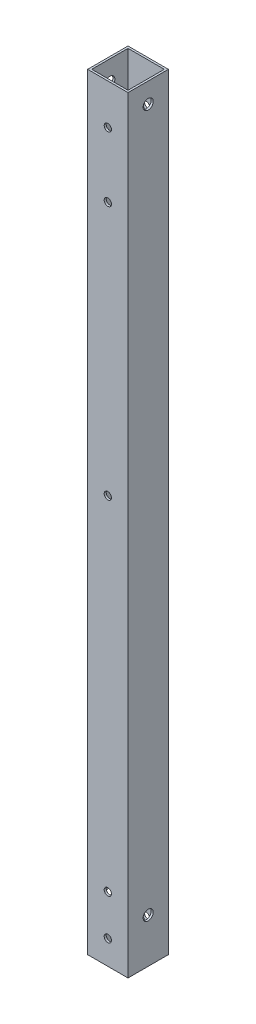
ISO-10303-21;
HEADER;
FILE_DESCRIPTION(('STEP AP214'),'2;1');
FILE_NAME('part.step','',(''),(''),'','','');
FILE_SCHEMA(('AUTOMOTIVE_DESIGN { 1 0 10303 214 1 1 1 1 }'));
ENDSEC;
DATA;
#1=APPLICATION_CONTEXT('core data for automotive mechanical design processes');
#2=APPLICATION_PROTOCOL_DEFINITION('international standard','automotive_design',2000,#1);
#3=PRODUCT_CONTEXT('',#1,'mechanical');
#4=PRODUCT('Part','Part','',(#3));
#5=PRODUCT_RELATED_PRODUCT_CATEGORY('part','',(#4));
#6=PRODUCT_DEFINITION_FORMATION('','',#4);
#7=PRODUCT_DEFINITION_CONTEXT('part definition',#1,'design');
#8=PRODUCT_DEFINITION('design','',#6,#7);
#9=PRODUCT_DEFINITION_SHAPE('','',#8);
#10=(LENGTH_UNIT() NAMED_UNIT(*) SI_UNIT(.MILLI.,.METRE.));
#11=(NAMED_UNIT(*) PLANE_ANGLE_UNIT() SI_UNIT($,.RADIAN.));
#12=(NAMED_UNIT(*) SI_UNIT($,.STERADIAN.) SOLID_ANGLE_UNIT());
#13=UNCERTAINTY_MEASURE_WITH_UNIT(LENGTH_MEASURE(1.E-05),#10,'distance_accuracy_value','');
#14=(GEOMETRIC_REPRESENTATION_CONTEXT(3) GLOBAL_UNCERTAINTY_ASSIGNED_CONTEXT((#13)) GLOBAL_UNIT_ASSIGNED_CONTEXT((#10,
#11,#12)) REPRESENTATION_CONTEXT('',''));
#15=CARTESIAN_POINT('',(0.,0.,0.));
#16=DIRECTION('',(0.,0.,1.));
#17=DIRECTION('',(1.,0.,0.));
#18=AXIS2_PLACEMENT_3D('',#15,#16,#17);
#19=CARTESIAN_POINT('',(0.,482.6,0.));
#20=DIRECTION('',(0.,-1.,0.));
#21=DIRECTION('',(0.,0.,-1.));
#22=AXIS2_PLACEMENT_3D('',#19,#20,#21);
#23=PLANE('',#22);
#24=DIRECTION('',(1.,0.,0.));
#25=VECTOR('',#24,1.);
#26=CARTESIAN_POINT('',(25.4,482.6,0.));
#27=LINE('',#26,#25);
#28=CARTESIAN_POINT('',(0.,482.6,0.));
#29=VERTEX_POINT('',#28);
#30=CARTESIAN_POINT('',(25.4,482.6,0.));
#31=VERTEX_POINT('',#30);
#32=EDGE_CURVE('E155',#29,#31,#27,.T.);
#33=ORIENTED_EDGE('',*,*,#32,.T.);
#34=DIRECTION('',(0.,0.,-1.));
#35=VECTOR('',#34,1.);
#36=CARTESIAN_POINT('',(25.4,482.6,-25.4));
#37=LINE('',#36,#35);
#38=CARTESIAN_POINT('',(25.4,482.6,-25.4));
#39=VERTEX_POINT('',#38);
#40=EDGE_CURVE('E159',#31,#39,#37,.T.);
#41=ORIENTED_EDGE('',*,*,#40,.T.);
#42=DIRECTION('',(-1.,0.,0.));
#43=VECTOR('',#42,1.);
#44=CARTESIAN_POINT('',(0.,482.6,-25.4));
#45=LINE('',#44,#43);
#46=CARTESIAN_POINT('',(0.,482.6,-25.4));
#47=VERTEX_POINT('',#46);
#48=EDGE_CURVE('E163',#39,#47,#45,.T.);
#49=ORIENTED_EDGE('',*,*,#48,.T.);
#50=DIRECTION('',(0.,0.,1.));
#51=VECTOR('',#50,1.);
#52=CARTESIAN_POINT('',(0.,482.6,0.));
#53=LINE('',#52,#51);
#54=EDGE_CURVE('E166',#47,#29,#53,.T.);
#55=ORIENTED_EDGE('',*,*,#54,.T.);
#56=EDGE_LOOP('',(#33,#41,#49,#55));
#57=FACE_BOUND('',#56,.T.);
#58=DIRECTION('',(1.,0.,0.));
#59=VECTOR('',#58,1.);
#60=CARTESIAN_POINT('',(1.27,482.6,-1.27));
#61=LINE('',#60,#59);
#62=CARTESIAN_POINT('',(1.27,482.6,-1.27));
#63=VERTEX_POINT('',#62);
#64=CARTESIAN_POINT('',(24.13,482.6,-1.27));
#65=VERTEX_POINT('',#64);
#66=EDGE_CURVE('E109',#63,#65,#61,.T.);
#67=ORIENTED_EDGE('',*,*,#66,.F.);
#68=DIRECTION('',(0.,0.,1.));
#69=VECTOR('',#68,1.);
#70=CARTESIAN_POINT('',(1.27,482.6,-12.3614591557052));
#71=LINE('',#70,#69);
#72=CARTESIAN_POINT('',(1.27,482.6,-24.13));
#73=VERTEX_POINT('',#72);
#74=EDGE_CURVE('E103',#73,#63,#71,.T.);
#75=ORIENTED_EDGE('',*,*,#74,.F.);
#76=DIRECTION('',(-1.,0.,0.));
#77=VECTOR('',#76,1.);
#78=CARTESIAN_POINT('',(12.7,482.6,-24.13));
#79=LINE('',#78,#77);
#80=CARTESIAN_POINT('',(24.13,482.6,-24.13));
#81=VERTEX_POINT('',#80);
#82=EDGE_CURVE('E128',#81,#73,#79,.T.);
#83=ORIENTED_EDGE('',*,*,#82,.F.);
#84=DIRECTION('',(0.,0.,-1.));
#85=VECTOR('',#84,1.);
#86=CARTESIAN_POINT('',(24.13,482.6,-1.27));
#87=LINE('',#86,#85);
#88=EDGE_CURVE('E124',#65,#81,#87,.T.);
#89=ORIENTED_EDGE('',*,*,#88,.F.);
#90=EDGE_LOOP('',(#67,#75,#83,#89));
#91=FACE_BOUND('',#90,.T.);
#92=ADVANCED_FACE('F38',(#57,#91),#23,.F.);
#93=CARTESIAN_POINT('',(0.,0.,0.));
#94=DIRECTION('',(0.,-1.,0.));
#95=DIRECTION('',(0.,0.,-1.));
#96=AXIS2_PLACEMENT_3D('',#93,#94,#95);
#97=PLANE('',#96);
#98=DIRECTION('',(1.,0.,0.));
#99=VECTOR('',#98,1.);
#100=CARTESIAN_POINT('',(25.4,0.,0.));
#101=LINE('',#100,#99);
#102=CARTESIAN_POINT('',(0.,0.,0.));
#103=VERTEX_POINT('',#102);
#104=CARTESIAN_POINT('',(25.4,0.,0.));
#105=VERTEX_POINT('',#104);
#106=EDGE_CURVE('E120',#103,#105,#101,.T.);
#107=ORIENTED_EDGE('',*,*,#106,.F.);
#108=DIRECTION('',(0.,0.,1.));
#109=VECTOR('',#108,1.);
#110=CARTESIAN_POINT('',(0.,0.,0.));
#111=LINE('',#110,#109);
#112=CARTESIAN_POINT('',(0.,0.,-25.4));
#113=VERTEX_POINT('',#112);
#114=EDGE_CURVE('E160',#113,#103,#111,.T.);
#115=ORIENTED_EDGE('',*,*,#114,.F.);
#116=DIRECTION('',(-1.,0.,0.));
#117=VECTOR('',#116,1.);
#118=CARTESIAN_POINT('',(0.,0.,-25.4));
#119=LINE('',#118,#117);
#120=CARTESIAN_POINT('',(25.4,0.,-25.4));
#121=VERTEX_POINT('',#120);
#122=EDGE_CURVE('E176',#121,#113,#119,.T.);
#123=ORIENTED_EDGE('',*,*,#122,.F.);
#124=DIRECTION('',(0.,0.,-1.));
#125=VECTOR('',#124,1.);
#126=CARTESIAN_POINT('',(25.4,0.,-25.4));
#127=LINE('',#126,#125);
#128=EDGE_CURVE('E173',#105,#121,#127,.T.);
#129=ORIENTED_EDGE('',*,*,#128,.F.);
#130=EDGE_LOOP('',(#107,#115,#123,#129));
#131=FACE_BOUND('',#130,.T.);
#132=DIRECTION('',(0.,0.,1.));
#133=VECTOR('',#132,1.);
#134=CARTESIAN_POINT('',(1.27,0.,-12.3614591557052));
#135=LINE('',#134,#133);
#136=CARTESIAN_POINT('',(1.27,0.,-24.13));
#137=VERTEX_POINT('',#136);
#138=CARTESIAN_POINT('',(1.27,0.,-1.27));
#139=VERTEX_POINT('',#138);
#140=EDGE_CURVE('E110',#137,#139,#135,.T.);
#141=ORIENTED_EDGE('',*,*,#140,.T.);
#142=DIRECTION('',(1.,0.,0.));
#143=VECTOR('',#142,1.);
#144=CARTESIAN_POINT('',(24.13,0.,-1.27));
#145=LINE('',#144,#143);
#146=CARTESIAN_POINT('',(24.13,0.,-1.27));
#147=VERTEX_POINT('',#146);
#148=EDGE_CURVE('E117',#139,#147,#145,.T.);
#149=ORIENTED_EDGE('',*,*,#148,.T.);
#150=DIRECTION('',(0.,0.,-1.));
#151=VECTOR('',#150,1.);
#152=CARTESIAN_POINT('',(24.13,0.,-24.13));
#153=LINE('',#152,#151);
#154=CARTESIAN_POINT('',(24.13,0.,-24.13));
#155=VERTEX_POINT('',#154);
#156=EDGE_CURVE('E136',#147,#155,#153,.T.);
#157=ORIENTED_EDGE('',*,*,#156,.T.);
#158=DIRECTION('',(-1.,0.,0.));
#159=VECTOR('',#158,1.);
#160=CARTESIAN_POINT('',(1.27,0.,-24.13));
#161=LINE('',#160,#159);
#162=EDGE_CURVE('E141',#155,#137,#161,.T.);
#163=ORIENTED_EDGE('',*,*,#162,.T.);
#164=EDGE_LOOP('',(#141,#149,#157,#163));
#165=FACE_BOUND('',#164,.T.);
#166=ADVANCED_FACE('F314',(#131,#165),#97,.T.);
#167=CARTESIAN_POINT('',(25.4,482.6,0.));
#168=DIRECTION('',(0.,0.,-1.));
#169=DIRECTION('',(-1.,0.,0.));
#170=AXIS2_PLACEMENT_3D('',#167,#168,#169);
#171=PLANE('',#170);
#172=CARTESIAN_POINT('',(12.7,15.24,0.));
#173=DIRECTION('',(0.,0.,-1.));
#174=DIRECTION('',(-1.,0.,0.));
#175=AXIS2_PLACEMENT_3D('',#172,#173,#174);
#176=CIRCLE('',#175,2.286);
#177=CARTESIAN_POINT('',(10.414,15.24,0.));
#178=VERTEX_POINT('',#177);
#179=EDGE_CURVE('E218',#178,#178,#176,.T.);
#180=ORIENTED_EDGE('',*,*,#179,.T.);
#181=EDGE_LOOP('',(#180));
#182=FACE_BOUND('',#181,.T.);
#183=CARTESIAN_POINT('',(12.7,457.2,0.));
#184=DIRECTION('',(0.,0.,-1.));
#185=DIRECTION('',(-1.,0.,0.));
#186=AXIS2_PLACEMENT_3D('',#183,#184,#185);
#187=CIRCLE('',#186,2.28600000000001);
#188=CARTESIAN_POINT('',(10.414,457.2,0.));
#189=VERTEX_POINT('',#188);
#190=EDGE_CURVE('E213',#189,#189,#187,.T.);
#191=ORIENTED_EDGE('',*,*,#190,.T.);
#192=EDGE_LOOP('',(#191));
#193=FACE_BOUND('',#192,.T.);
#194=CARTESIAN_POINT('',(12.7,256.54,0.));
#195=DIRECTION('',(0.,0.,-1.));
#196=DIRECTION('',(-1.,0.,0.));
#197=AXIS2_PLACEMENT_3D('',#194,#195,#196);
#198=CIRCLE('',#197,2.28600000000001);
#199=CARTESIAN_POINT('',(10.414,256.54,0.));
#200=VERTEX_POINT('',#199);
#201=EDGE_CURVE('E207',#200,#200,#198,.T.);
#202=ORIENTED_EDGE('',*,*,#201,.T.);
#203=EDGE_LOOP('',(#202));
#204=FACE_BOUND('',#203,.T.);
#205=CARTESIAN_POINT('',(12.7,40.64,0.));
#206=DIRECTION('',(0.,0.,-1.));
#207=DIRECTION('',(-1.,0.,0.));
#208=AXIS2_PLACEMENT_3D('',#205,#206,#207);
#209=CIRCLE('',#208,2.286);
#210=CARTESIAN_POINT('',(10.414,40.64,0.));
#211=VERTEX_POINT('',#210);
#212=EDGE_CURVE('E201',#211,#211,#209,.T.);
#213=ORIENTED_EDGE('',*,*,#212,.T.);
#214=EDGE_LOOP('',(#213));
#215=FACE_BOUND('',#214,.T.);
#216=CARTESIAN_POINT('',(12.7,416.56,0.));
#217=DIRECTION('',(0.,0.,-1.));
#218=DIRECTION('',(-1.,0.,0.));
#219=AXIS2_PLACEMENT_3D('',#216,#217,#218);
#220=CIRCLE('',#219,2.28600000000001);
#221=CARTESIAN_POINT('',(10.414,416.56,0.));
#222=VERTEX_POINT('',#221);
#223=EDGE_CURVE('E195',#222,#222,#220,.T.);
#224=ORIENTED_EDGE('',*,*,#223,.T.);
#225=EDGE_LOOP('',(#224));
#226=FACE_BOUND('',#225,.T.);
#227=ORIENTED_EDGE('',*,*,#106,.T.);
#228=DIRECTION('',(0.,-1.,0.));
#229=VECTOR('',#228,1.);
#230=CARTESIAN_POINT('',(25.4,482.6,0.));
#231=LINE('',#230,#229);
#232=EDGE_CURVE('E11',#31,#105,#231,.T.);
#233=ORIENTED_EDGE('',*,*,#232,.F.);
#234=ORIENTED_EDGE('',*,*,#32,.F.);
#235=DIRECTION('',(0.,-1.,0.));
#236=VECTOR('',#235,1.);
#237=CARTESIAN_POINT('',(0.,482.6,0.));
#238=LINE('',#237,#236);
#239=EDGE_CURVE('E169',#29,#103,#238,.T.);
#240=ORIENTED_EDGE('',*,*,#239,.T.);
#241=EDGE_LOOP('',(#227,#233,#234,#240));
#242=FACE_BOUND('',#241,.T.);
#243=ADVANCED_FACE('F40',(#182,#193,#204,#215,#226,#242),#171,.F.);
#244=CARTESIAN_POINT('',(25.4,482.6,-25.4));
#245=DIRECTION('',(-1.,0.,0.));
#246=DIRECTION('',(0.,0.,1.));
#247=AXIS2_PLACEMENT_3D('',#244,#245,#246);
#248=PLANE('',#247);
#249=CARTESIAN_POINT('',(25.4,27.94,-12.7));
#250=DIRECTION('',(-1.,0.,0.));
#251=DIRECTION('',(0.,0.,1.));
#252=AXIS2_PLACEMENT_3D('',#249,#250,#251);
#253=CIRCLE('',#252,3.175);
#254=CARTESIAN_POINT('',(25.4,27.94,-9.525));
#255=VERTEX_POINT('',#254);
#256=EDGE_CURVE('E333',#255,#255,#253,.T.);
#257=ORIENTED_EDGE('',*,*,#256,.T.);
#258=EDGE_LOOP('',(#257));
#259=FACE_BOUND('',#258,.T.);
#260=CARTESIAN_POINT('',(25.4,469.9,-12.7));
#261=DIRECTION('',(-1.,0.,0.));
#262=DIRECTION('',(0.,0.,1.));
#263=AXIS2_PLACEMENT_3D('',#260,#261,#262);
#264=CIRCLE('',#263,3.175);
#265=CARTESIAN_POINT('',(25.4,469.9,-9.525));
#266=VERTEX_POINT('',#265);
#267=EDGE_CURVE('E223',#266,#266,#264,.T.);
#268=ORIENTED_EDGE('',*,*,#267,.T.);
#269=EDGE_LOOP('',(#268));
#270=FACE_BOUND('',#269,.T.);
#271=ORIENTED_EDGE('',*,*,#128,.T.);
#272=DIRECTION('',(0.,-1.,0.));
#273=VECTOR('',#272,1.);
#274=CARTESIAN_POINT('',(25.4,482.6,-25.4));
#275=LINE('',#274,#273);
#276=EDGE_CURVE('E48',#39,#121,#275,.T.);
#277=ORIENTED_EDGE('',*,*,#276,.F.);
#278=ORIENTED_EDGE('',*,*,#40,.F.);
#279=ORIENTED_EDGE('',*,*,#232,.T.);
#280=EDGE_LOOP('',(#271,#277,#278,#279));
#281=FACE_BOUND('',#280,.T.);
#282=ADVANCED_FACE('F323',(#259,#270,#281),#248,.F.);
#283=CARTESIAN_POINT('',(0.,482.6,-25.4));
#284=DIRECTION('',(0.,0.,1.));
#285=DIRECTION('',(1.,0.,0.));
#286=AXIS2_PLACEMENT_3D('',#283,#284,#285);
#287=PLANE('',#286);
#288=CARTESIAN_POINT('',(12.7,15.24,-25.4));
#289=DIRECTION('',(0.,0.,-1.));
#290=DIRECTION('',(-1.,0.,0.));
#291=AXIS2_PLACEMENT_3D('',#288,#289,#290);
#292=CIRCLE('',#291,2.286);
#293=CARTESIAN_POINT('',(10.414,15.24,-25.4));
#294=VERTEX_POINT('',#293);
#295=EDGE_CURVE('E229',#294,#294,#292,.T.);
#296=ORIENTED_EDGE('',*,*,#295,.F.);
#297=EDGE_LOOP('',(#296));
#298=FACE_BOUND('',#297,.T.);
#299=CARTESIAN_POINT('',(12.7,457.2,-25.4));
#300=DIRECTION('',(0.,0.,-1.));
#301=DIRECTION('',(-1.,0.,0.));
#302=AXIS2_PLACEMENT_3D('',#299,#300,#301);
#303=CIRCLE('',#302,2.28600000000001);
#304=CARTESIAN_POINT('',(10.414,457.2,-25.4));
#305=VERTEX_POINT('',#304);
#306=EDGE_CURVE('E252',#305,#305,#303,.T.);
#307=ORIENTED_EDGE('',*,*,#306,.F.);
#308=EDGE_LOOP('',(#307));
#309=FACE_BOUND('',#308,.T.);
#310=CARTESIAN_POINT('',(12.7,256.54,-25.4));
#311=DIRECTION('',(0.,0.,-1.));
#312=DIRECTION('',(-1.,0.,0.));
#313=AXIS2_PLACEMENT_3D('',#310,#311,#312);
#314=CIRCLE('',#313,2.28600000000001);
#315=CARTESIAN_POINT('',(10.414,256.54,-25.4));
#316=VERTEX_POINT('',#315);
#317=EDGE_CURVE('E262',#316,#316,#314,.T.);
#318=ORIENTED_EDGE('',*,*,#317,.F.);
#319=EDGE_LOOP('',(#318));
#320=FACE_BOUND('',#319,.T.);
#321=CARTESIAN_POINT('',(12.7,40.64,-25.4));
#322=DIRECTION('',(0.,0.,-1.));
#323=DIRECTION('',(-1.,0.,0.));
#324=AXIS2_PLACEMENT_3D('',#321,#322,#323);
#325=CIRCLE('',#324,2.286);
#326=CARTESIAN_POINT('',(10.414,40.64,-25.4));
#327=VERTEX_POINT('',#326);
#328=EDGE_CURVE('E272',#327,#327,#325,.T.);
#329=ORIENTED_EDGE('',*,*,#328,.F.);
#330=EDGE_LOOP('',(#329));
#331=FACE_BOUND('',#330,.T.);
#332=CARTESIAN_POINT('',(12.7,416.56,-25.4));
#333=DIRECTION('',(0.,0.,-1.));
#334=DIRECTION('',(-1.,0.,0.));
#335=AXIS2_PLACEMENT_3D('',#332,#333,#334);
#336=CIRCLE('',#335,2.28600000000001);
#337=CARTESIAN_POINT('',(10.414,416.56,-25.4));
#338=VERTEX_POINT('',#337);
#339=EDGE_CURVE('E282',#338,#338,#336,.T.);
#340=ORIENTED_EDGE('',*,*,#339,.F.);
#341=EDGE_LOOP('',(#340));
#342=FACE_BOUND('',#341,.T.);
#343=ORIENTED_EDGE('',*,*,#122,.T.);
#344=DIRECTION('',(0.,-1.,0.));
#345=VECTOR('',#344,1.);
#346=CARTESIAN_POINT('',(0.,482.6,-25.4));
#347=LINE('',#346,#345);
#348=EDGE_CURVE('E184',#47,#113,#347,.T.);
#349=ORIENTED_EDGE('',*,*,#348,.F.);
#350=ORIENTED_EDGE('',*,*,#48,.F.);
#351=ORIENTED_EDGE('',*,*,#276,.T.);
#352=EDGE_LOOP('',(#343,#349,#350,#351));
#353=FACE_BOUND('',#352,.T.);
#354=ADVANCED_FACE('F307',(#298,#309,#320,#331,#342,#353),#287,.F.);
#355=CARTESIAN_POINT('',(0.,482.6,0.));
#356=DIRECTION('',(1.,0.,0.));
#357=DIRECTION('',(0.,0.,-1.));
#358=AXIS2_PLACEMENT_3D('',#355,#356,#357);
#359=PLANE('',#358);
#360=CARTESIAN_POINT('',(0.,27.94,-12.7));
#361=DIRECTION('',(-1.,0.,0.));
#362=DIRECTION('',(0.,0.,1.));
#363=AXIS2_PLACEMENT_3D('',#360,#361,#362);
#364=CIRCLE('',#363,3.175);
#365=CARTESIAN_POINT('',(0.,27.94,-9.525));
#366=VERTEX_POINT('',#365);
#367=EDGE_CURVE('E406',#366,#366,#364,.T.);
#368=ORIENTED_EDGE('',*,*,#367,.F.);
#369=EDGE_LOOP('',(#368));
#370=FACE_BOUND('',#369,.T.);
#371=CARTESIAN_POINT('',(0.,469.9,-12.7));
#372=DIRECTION('',(-1.,0.,0.));
#373=DIRECTION('',(0.,0.,1.));
#374=AXIS2_PLACEMENT_3D('',#371,#372,#373);
#375=CIRCLE('',#374,3.175);
#376=CARTESIAN_POINT('',(0.,469.9,-9.525));
#377=VERTEX_POINT('',#376);
#378=EDGE_CURVE('E232',#377,#377,#375,.T.);
#379=ORIENTED_EDGE('',*,*,#378,.F.);
#380=EDGE_LOOP('',(#379));
#381=FACE_BOUND('',#380,.T.);
#382=ORIENTED_EDGE('',*,*,#114,.T.);
#383=ORIENTED_EDGE('',*,*,#239,.F.);
#384=ORIENTED_EDGE('',*,*,#54,.F.);
#385=ORIENTED_EDGE('',*,*,#348,.T.);
#386=EDGE_LOOP('',(#382,#383,#384,#385));
#387=FACE_BOUND('',#386,.T.);
#388=ADVANCED_FACE('F297',(#370,#381,#387),#359,.F.);
#389=CARTESIAN_POINT('',(24.13,482.6,-1.27));
#390=DIRECTION('',(0.,0.,-1.));
#391=DIRECTION('',(-1.,0.,0.));
#392=AXIS2_PLACEMENT_3D('',#389,#390,#391);
#393=PLANE('',#392);
#394=CARTESIAN_POINT('',(12.7,15.24,-1.27));
#395=DIRECTION('',(0.,0.,-1.));
#396=DIRECTION('',(-1.,0.,0.));
#397=AXIS2_PLACEMENT_3D('',#394,#395,#396);
#398=CIRCLE('',#397,2.286);
#399=CARTESIAN_POINT('',(10.414,15.24,-1.27));
#400=VERTEX_POINT('',#399);
#401=EDGE_CURVE('E217',#400,#400,#398,.T.);
#402=ORIENTED_EDGE('',*,*,#401,.F.);
#403=EDGE_LOOP('',(#402));
#404=FACE_BOUND('',#403,.T.);
#405=CARTESIAN_POINT('',(12.7,457.2,-1.27));
#406=DIRECTION('',(0.,0.,-1.));
#407=DIRECTION('',(-1.,0.,0.));
#408=AXIS2_PLACEMENT_3D('',#405,#406,#407);
#409=CIRCLE('',#408,2.28600000000001);
#410=CARTESIAN_POINT('',(10.414,457.2,-1.27));
#411=VERTEX_POINT('',#410);
#412=EDGE_CURVE('E212',#411,#411,#409,.T.);
#413=ORIENTED_EDGE('',*,*,#412,.F.);
#414=EDGE_LOOP('',(#413));
#415=FACE_BOUND('',#414,.T.);
#416=CARTESIAN_POINT('',(12.7,256.54,-1.27));
#417=DIRECTION('',(0.,0.,-1.));
#418=DIRECTION('',(-1.,0.,0.));
#419=AXIS2_PLACEMENT_3D('',#416,#417,#418);
#420=CIRCLE('',#419,2.28600000000001);
#421=CARTESIAN_POINT('',(10.414,256.54,-1.27));
#422=VERTEX_POINT('',#421);
#423=EDGE_CURVE('E206',#422,#422,#420,.T.);
#424=ORIENTED_EDGE('',*,*,#423,.F.);
#425=EDGE_LOOP('',(#424));
#426=FACE_BOUND('',#425,.T.);
#427=CARTESIAN_POINT('',(12.7,40.64,-1.27));
#428=DIRECTION('',(0.,0.,-1.));
#429=DIRECTION('',(-1.,0.,0.));
#430=AXIS2_PLACEMENT_3D('',#427,#428,#429);
#431=CIRCLE('',#430,2.286);
#432=CARTESIAN_POINT('',(10.414,40.64,-1.27));
#433=VERTEX_POINT('',#432);
#434=EDGE_CURVE('E200',#433,#433,#431,.T.);
#435=ORIENTED_EDGE('',*,*,#434,.F.);
#436=EDGE_LOOP('',(#435));
#437=FACE_BOUND('',#436,.T.);
#438=CARTESIAN_POINT('',(12.7,416.56,-1.27));
#439=DIRECTION('',(0.,0.,-1.));
#440=DIRECTION('',(-1.,0.,0.));
#441=AXIS2_PLACEMENT_3D('',#438,#439,#440);
#442=CIRCLE('',#441,2.28600000000001);
#443=CARTESIAN_POINT('',(10.414,416.56,-1.27));
#444=VERTEX_POINT('',#443);
#445=EDGE_CURVE('E137',#444,#444,#442,.T.);
#446=ORIENTED_EDGE('',*,*,#445,.F.);
#447=EDGE_LOOP('',(#446));
#448=FACE_BOUND('',#447,.T.);
#449=ORIENTED_EDGE('',*,*,#148,.F.);
#450=DIRECTION('',(0.,-1.,0.));
#451=VECTOR('',#450,1.);
#452=CARTESIAN_POINT('',(1.27,482.6,-1.27));
#453=LINE('',#452,#451);
#454=EDGE_CURVE('E61',#63,#139,#453,.T.);
#455=ORIENTED_EDGE('',*,*,#454,.F.);
#456=ORIENTED_EDGE('',*,*,#66,.T.);
#457=DIRECTION('',(0.,-1.,0.));
#458=VECTOR('',#457,1.);
#459=CARTESIAN_POINT('',(24.13,482.6,-1.27));
#460=LINE('',#459,#458);
#461=EDGE_CURVE('E121',#65,#147,#460,.T.);
#462=ORIENTED_EDGE('',*,*,#461,.T.);
#463=EDGE_LOOP('',(#449,#455,#456,#462));
#464=FACE_BOUND('',#463,.T.);
#465=ADVANCED_FACE('F113',(#404,#415,#426,#437,#448,#464),#393,.T.);
#466=CARTESIAN_POINT('',(24.13,482.6,-24.13));
#467=DIRECTION('',(-1.,0.,0.));
#468=DIRECTION('',(0.,0.,1.));
#469=AXIS2_PLACEMENT_3D('',#466,#467,#468);
#470=PLANE('',#469);
#471=CARTESIAN_POINT('',(24.13,27.94,-12.7));
#472=DIRECTION('',(-1.,0.,0.));
#473=DIRECTION('',(0.,0.,1.));
#474=AXIS2_PLACEMENT_3D('',#471,#472,#473);
#475=CIRCLE('',#474,3.175);
#476=CARTESIAN_POINT('',(24.13,27.94,-9.525));
#477=VERTEX_POINT('',#476);
#478=EDGE_CURVE('E238',#477,#477,#475,.T.);
#479=ORIENTED_EDGE('',*,*,#478,.F.);
#480=EDGE_LOOP('',(#479));
#481=FACE_BOUND('',#480,.T.);
#482=CARTESIAN_POINT('',(24.13,469.9,-12.7));
#483=DIRECTION('',(-1.,0.,0.));
#484=DIRECTION('',(0.,0.,1.));
#485=AXIS2_PLACEMENT_3D('',#482,#483,#484);
#486=CIRCLE('',#485,3.175);
#487=CARTESIAN_POINT('',(24.13,469.9,-9.525));
#488=VERTEX_POINT('',#487);
#489=EDGE_CURVE('E222',#488,#488,#486,.T.);
#490=ORIENTED_EDGE('',*,*,#489,.F.);
#491=EDGE_LOOP('',(#490));
#492=FACE_BOUND('',#491,.T.);
#493=ORIENTED_EDGE('',*,*,#156,.F.);
#494=ORIENTED_EDGE('',*,*,#461,.F.);
#495=ORIENTED_EDGE('',*,*,#88,.T.);
#496=DIRECTION('',(0.,-1.,0.));
#497=VECTOR('',#496,1.);
#498=CARTESIAN_POINT('',(24.13,482.6,-24.13));
#499=LINE('',#498,#497);
#500=EDGE_CURVE('E149',#81,#155,#499,.T.);
#501=ORIENTED_EDGE('',*,*,#500,.T.);
#502=EDGE_LOOP('',(#493,#494,#495,#501));
#503=FACE_BOUND('',#502,.T.);
#504=ADVANCED_FACE('F296',(#481,#492,#503),#470,.T.);
#505=CARTESIAN_POINT('',(1.27,482.6,-24.13));
#506=DIRECTION('',(0.,0.,1.));
#507=DIRECTION('',(1.,0.,0.));
#508=AXIS2_PLACEMENT_3D('',#505,#506,#507);
#509=PLANE('',#508);
#510=CARTESIAN_POINT('',(12.7,15.24,-24.13));
#511=DIRECTION('',(0.,0.,1.));
#512=DIRECTION('',(1.,0.,0.));
#513=AXIS2_PLACEMENT_3D('',#510,#511,#512);
#514=CIRCLE('',#513,2.286);
#515=CARTESIAN_POINT('',(14.986,15.24,-24.13));
#516=VERTEX_POINT('',#515);
#517=EDGE_CURVE('E214',#516,#516,#514,.T.);
#518=ORIENTED_EDGE('',*,*,#517,.F.);
#519=EDGE_LOOP('',(#518));
#520=FACE_BOUND('',#519,.T.);
#521=CARTESIAN_POINT('',(12.7,457.2,-24.13));
#522=DIRECTION('',(0.,0.,1.));
#523=DIRECTION('',(1.,0.,0.));
#524=AXIS2_PLACEMENT_3D('',#521,#522,#523);
#525=CIRCLE('',#524,2.28600000000001);
#526=CARTESIAN_POINT('',(14.986,457.2,-24.13));
#527=VERTEX_POINT('',#526);
#528=EDGE_CURVE('E208',#527,#527,#525,.T.);
#529=ORIENTED_EDGE('',*,*,#528,.F.);
#530=EDGE_LOOP('',(#529));
#531=FACE_BOUND('',#530,.T.);
#532=CARTESIAN_POINT('',(12.7,256.54,-24.13));
#533=DIRECTION('',(0.,0.,1.));
#534=DIRECTION('',(1.,0.,0.));
#535=AXIS2_PLACEMENT_3D('',#532,#533,#534);
#536=CIRCLE('',#535,2.28600000000001);
#537=CARTESIAN_POINT('',(14.986,256.54,-24.13));
#538=VERTEX_POINT('',#537);
#539=EDGE_CURVE('E202',#538,#538,#536,.T.);
#540=ORIENTED_EDGE('',*,*,#539,.F.);
#541=EDGE_LOOP('',(#540));
#542=FACE_BOUND('',#541,.T.);
#543=CARTESIAN_POINT('',(12.7,40.64,-24.13));
#544=DIRECTION('',(0.,0.,1.));
#545=DIRECTION('',(1.,0.,0.));
#546=AXIS2_PLACEMENT_3D('',#543,#544,#545);
#547=CIRCLE('',#546,2.286);
#548=CARTESIAN_POINT('',(14.986,40.64,-24.13));
#549=VERTEX_POINT('',#548);
#550=EDGE_CURVE('E196',#549,#549,#547,.T.);
#551=ORIENTED_EDGE('',*,*,#550,.F.);
#552=EDGE_LOOP('',(#551));
#553=FACE_BOUND('',#552,.T.);
#554=CARTESIAN_POINT('',(12.7,416.56,-24.13));
#555=DIRECTION('',(0.,0.,1.));
#556=DIRECTION('',(1.,0.,0.));
#557=AXIS2_PLACEMENT_3D('',#554,#555,#556);
#558=CIRCLE('',#557,2.28600000000001);
#559=CARTESIAN_POINT('',(14.986,416.56,-24.13));
#560=VERTEX_POINT('',#559);
#561=EDGE_CURVE('E191',#560,#560,#558,.T.);
#562=ORIENTED_EDGE('',*,*,#561,.F.);
#563=EDGE_LOOP('',(#562));
#564=FACE_BOUND('',#563,.T.);
#565=ORIENTED_EDGE('',*,*,#162,.F.);
#566=ORIENTED_EDGE('',*,*,#500,.F.);
#567=ORIENTED_EDGE('',*,*,#82,.T.);
#568=DIRECTION('',(0.,-1.,0.));
#569=VECTOR('',#568,1.);
#570=CARTESIAN_POINT('',(1.27,482.6,-24.13));
#571=LINE('',#570,#569);
#572=EDGE_CURVE('E56',#73,#137,#571,.T.);
#573=ORIENTED_EDGE('',*,*,#572,.T.);
#574=EDGE_LOOP('',(#565,#566,#567,#573));
#575=FACE_BOUND('',#574,.T.);
#576=ADVANCED_FACE('F304',(#520,#531,#542,#553,#564,#575),#509,.T.);
#577=CARTESIAN_POINT('',(1.27,482.6,-12.3614591557052));
#578=DIRECTION('',(1.,0.,0.));
#579=DIRECTION('',(0.,0.,-1.));
#580=AXIS2_PLACEMENT_3D('',#577,#578,#579);
#581=PLANE('',#580);
#582=CARTESIAN_POINT('',(1.27,27.94,-12.7));
#583=DIRECTION('',(1.,0.,0.));
#584=DIRECTION('',(0.,0.,-1.));
#585=AXIS2_PLACEMENT_3D('',#582,#583,#584);
#586=CIRCLE('',#585,3.175);
#587=CARTESIAN_POINT('',(1.27,27.94,-15.875));
#588=VERTEX_POINT('',#587);
#589=EDGE_CURVE('E42',#588,#588,#586,.T.);
#590=ORIENTED_EDGE('',*,*,#589,.F.);
#591=EDGE_LOOP('',(#590));
#592=FACE_BOUND('',#591,.T.);
#593=CARTESIAN_POINT('',(1.27,469.9,-12.7));
#594=DIRECTION('',(1.,0.,0.));
#595=DIRECTION('',(0.,0.,-1.));
#596=AXIS2_PLACEMENT_3D('',#593,#594,#595);
#597=CIRCLE('',#596,3.175);
#598=CARTESIAN_POINT('',(1.27,469.9,-15.875));
#599=VERTEX_POINT('',#598);
#600=EDGE_CURVE('E219',#599,#599,#597,.T.);
#601=ORIENTED_EDGE('',*,*,#600,.F.);
#602=EDGE_LOOP('',(#601));
#603=FACE_BOUND('',#602,.T.);
#604=ORIENTED_EDGE('',*,*,#140,.F.);
#605=ORIENTED_EDGE('',*,*,#572,.F.);
#606=ORIENTED_EDGE('',*,*,#74,.T.);
#607=ORIENTED_EDGE('',*,*,#454,.T.);
#608=EDGE_LOOP('',(#604,#605,#606,#607));
#609=FACE_BOUND('',#608,.T.);
#610=ADVANCED_FACE('F104',(#592,#603,#609),#581,.T.);
#611=CARTESIAN_POINT('',(12.7,416.56,0.));
#612=DIRECTION('',(0.,0.,-1.));
#613=DIRECTION('',(-1.,0.,0.));
#614=AXIS2_PLACEMENT_3D('',#611,#612,#613);
#615=CYLINDRICAL_SURFACE('',#614,2.28600000000001);
#616=ORIENTED_EDGE('',*,*,#561,.T.);
#617=EDGE_LOOP('',(#616));
#618=FACE_BOUND('',#617,.T.);
#619=ORIENTED_EDGE('',*,*,#339,.T.);
#620=EDGE_LOOP('',(#619));
#621=FACE_BOUND('',#620,.T.);
#622=ADVANCED_FACE('F358',(#618,#621),#615,.F.);
#623=ORIENTED_EDGE('',*,*,#445,.T.);
#624=EDGE_LOOP('',(#623));
#625=FACE_BOUND('',#624,.T.);
#626=ORIENTED_EDGE('',*,*,#223,.F.);
#627=EDGE_LOOP('',(#626));
#628=FACE_BOUND('',#627,.T.);
#629=ADVANCED_FACE('F292',(#625,#628),#615,.F.);
#630=CARTESIAN_POINT('',(12.7,40.64,0.));
#631=DIRECTION('',(0.,0.,-1.));
#632=DIRECTION('',(-1.,0.,0.));
#633=AXIS2_PLACEMENT_3D('',#630,#631,#632);
#634=CYLINDRICAL_SURFACE('',#633,2.286);
#635=ORIENTED_EDGE('',*,*,#550,.T.);
#636=EDGE_LOOP('',(#635));
#637=FACE_BOUND('',#636,.T.);
#638=ORIENTED_EDGE('',*,*,#328,.T.);
#639=EDGE_LOOP('',(#638));
#640=FACE_BOUND('',#639,.T.);
#641=ADVANCED_FACE('F367',(#637,#640),#634,.F.);
#642=ORIENTED_EDGE('',*,*,#434,.T.);
#643=EDGE_LOOP('',(#642));
#644=FACE_BOUND('',#643,.T.);
#645=ORIENTED_EDGE('',*,*,#212,.F.);
#646=EDGE_LOOP('',(#645));
#647=FACE_BOUND('',#646,.T.);
#648=ADVANCED_FACE('F370',(#644,#647),#634,.F.);
#649=CARTESIAN_POINT('',(12.7,256.54,0.));
#650=DIRECTION('',(0.,0.,-1.));
#651=DIRECTION('',(-1.,0.,0.));
#652=AXIS2_PLACEMENT_3D('',#649,#650,#651);
#653=CYLINDRICAL_SURFACE('',#652,2.28600000000001);
#654=ORIENTED_EDGE('',*,*,#539,.T.);
#655=EDGE_LOOP('',(#654));
#656=FACE_BOUND('',#655,.T.);
#657=ORIENTED_EDGE('',*,*,#317,.T.);
#658=EDGE_LOOP('',(#657));
#659=FACE_BOUND('',#658,.T.);
#660=ADVANCED_FACE('F372',(#656,#659),#653,.F.);
#661=ORIENTED_EDGE('',*,*,#423,.T.);
#662=EDGE_LOOP('',(#661));
#663=FACE_BOUND('',#662,.T.);
#664=ORIENTED_EDGE('',*,*,#201,.F.);
#665=EDGE_LOOP('',(#664));
#666=FACE_BOUND('',#665,.T.);
#667=ADVANCED_FACE('F375',(#663,#666),#653,.F.);
#668=CARTESIAN_POINT('',(12.7,457.2,0.));
#669=DIRECTION('',(0.,0.,-1.));
#670=DIRECTION('',(-1.,0.,0.));
#671=AXIS2_PLACEMENT_3D('',#668,#669,#670);
#672=CYLINDRICAL_SURFACE('',#671,2.28600000000001);
#673=ORIENTED_EDGE('',*,*,#528,.T.);
#674=EDGE_LOOP('',(#673));
#675=FACE_BOUND('',#674,.T.);
#676=ORIENTED_EDGE('',*,*,#306,.T.);
#677=EDGE_LOOP('',(#676));
#678=FACE_BOUND('',#677,.T.);
#679=ADVANCED_FACE('F377',(#675,#678),#672,.F.);
#680=ORIENTED_EDGE('',*,*,#412,.T.);
#681=EDGE_LOOP('',(#680));
#682=FACE_BOUND('',#681,.T.);
#683=ORIENTED_EDGE('',*,*,#190,.F.);
#684=EDGE_LOOP('',(#683));
#685=FACE_BOUND('',#684,.T.);
#686=ADVANCED_FACE('F380',(#682,#685),#672,.F.);
#687=CARTESIAN_POINT('',(12.7,15.24,0.));
#688=DIRECTION('',(0.,0.,-1.));
#689=DIRECTION('',(-1.,0.,0.));
#690=AXIS2_PLACEMENT_3D('',#687,#688,#689);
#691=CYLINDRICAL_SURFACE('',#690,2.286);
#692=ORIENTED_EDGE('',*,*,#517,.T.);
#693=EDGE_LOOP('',(#692));
#694=FACE_BOUND('',#693,.T.);
#695=ORIENTED_EDGE('',*,*,#295,.T.);
#696=EDGE_LOOP('',(#695));
#697=FACE_BOUND('',#696,.T.);
#698=ADVANCED_FACE('F382',(#694,#697),#691,.F.);
#699=ORIENTED_EDGE('',*,*,#401,.T.);
#700=EDGE_LOOP('',(#699));
#701=FACE_BOUND('',#700,.T.);
#702=ORIENTED_EDGE('',*,*,#179,.F.);
#703=EDGE_LOOP('',(#702));
#704=FACE_BOUND('',#703,.T.);
#705=ADVANCED_FACE('F385',(#701,#704),#691,.F.);
#706=CARTESIAN_POINT('',(25.4,469.9,-12.7));
#707=DIRECTION('',(-1.,0.,0.));
#708=DIRECTION('',(0.,0.,1.));
#709=AXIS2_PLACEMENT_3D('',#706,#707,#708);
#710=CYLINDRICAL_SURFACE('',#709,3.175);
#711=ORIENTED_EDGE('',*,*,#600,.T.);
#712=EDGE_LOOP('',(#711));
#713=FACE_BOUND('',#712,.T.);
#714=ORIENTED_EDGE('',*,*,#378,.T.);
#715=EDGE_LOOP('',(#714));
#716=FACE_BOUND('',#715,.T.);
#717=ADVANCED_FACE('F387',(#713,#716),#710,.F.);
#718=ORIENTED_EDGE('',*,*,#489,.T.);
#719=EDGE_LOOP('',(#718));
#720=FACE_BOUND('',#719,.T.);
#721=ORIENTED_EDGE('',*,*,#267,.F.);
#722=EDGE_LOOP('',(#721));
#723=FACE_BOUND('',#722,.T.);
#724=ADVANCED_FACE('F390',(#720,#723),#710,.F.);
#725=CARTESIAN_POINT('',(25.4,27.94,-12.7));
#726=DIRECTION('',(-1.,0.,0.));
#727=DIRECTION('',(0.,0.,1.));
#728=AXIS2_PLACEMENT_3D('',#725,#726,#727);
#729=CYLINDRICAL_SURFACE('',#728,3.175);
#730=ORIENTED_EDGE('',*,*,#589,.T.);
#731=EDGE_LOOP('',(#730));
#732=FACE_BOUND('',#731,.T.);
#733=ORIENTED_EDGE('',*,*,#367,.T.);
#734=EDGE_LOOP('',(#733));
#735=FACE_BOUND('',#734,.T.);
#736=ADVANCED_FACE('F391',(#732,#735),#729,.F.);
#737=ORIENTED_EDGE('',*,*,#478,.T.);
#738=EDGE_LOOP('',(#737));
#739=FACE_BOUND('',#738,.T.);
#740=ORIENTED_EDGE('',*,*,#256,.F.);
#741=EDGE_LOOP('',(#740));
#742=FACE_BOUND('',#741,.T.);
#743=ADVANCED_FACE('F393',(#739,#742),#729,.F.);
#744=CLOSED_SHELL('',(#92,#166,#243,#282,#354,#388,#465,#504,#576,#610,#622,#629,#641,#648,#660,
#667,#679,#686,#698,#705,#717,#724,#736,#743));
#745=MANIFOLD_SOLID_BREP('B2',#744);
#746=ADVANCED_BREP_SHAPE_REPRESENTATION('',(#18,#745),#14);
#747=SHAPE_DEFINITION_REPRESENTATION(#9,#746);
ENDSEC;
END-ISO-10303-21;
